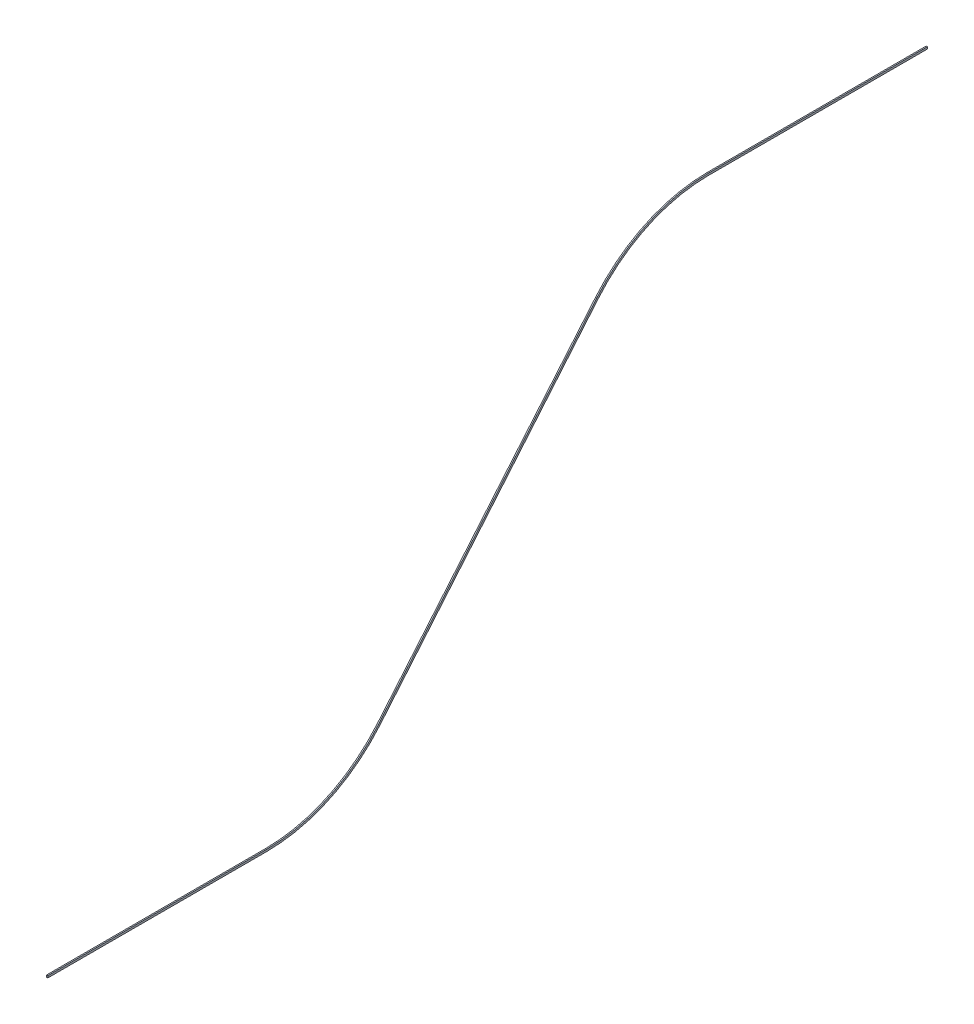
ISO-10303-21;
HEADER;
FILE_DESCRIPTION(('STEP AP214'),'2;1');
FILE_NAME('part.step','',(''),(''),'','','');
FILE_SCHEMA(('AUTOMOTIVE_DESIGN { 1 0 10303 214 1 1 1 1 }'));
ENDSEC;
DATA;
#1=APPLICATION_CONTEXT('core data for automotive mechanical design processes');
#2=APPLICATION_PROTOCOL_DEFINITION('international standard','automotive_design',2000,#1);
#3=PRODUCT_CONTEXT('',#1,'mechanical');
#4=PRODUCT('Part','Part','',(#3));
#5=PRODUCT_RELATED_PRODUCT_CATEGORY('part','',(#4));
#6=PRODUCT_DEFINITION_FORMATION('','',#4);
#7=PRODUCT_DEFINITION_CONTEXT('part definition',#1,'design');
#8=PRODUCT_DEFINITION('design','',#6,#7);
#9=PRODUCT_DEFINITION_SHAPE('','',#8);
#10=(LENGTH_UNIT() NAMED_UNIT(*) SI_UNIT(.MILLI.,.METRE.));
#11=(NAMED_UNIT(*) PLANE_ANGLE_UNIT() SI_UNIT($,.RADIAN.));
#12=(NAMED_UNIT(*) SI_UNIT($,.STERADIAN.) SOLID_ANGLE_UNIT());
#13=UNCERTAINTY_MEASURE_WITH_UNIT(LENGTH_MEASURE(1.E-05),#10,'distance_accuracy_value','');
#14=(GEOMETRIC_REPRESENTATION_CONTEXT(3) GLOBAL_UNCERTAINTY_ASSIGNED_CONTEXT((#13)) GLOBAL_UNIT_ASSIGNED_CONTEXT((#10,
#11,#12)) REPRESENTATION_CONTEXT('',''));
#15=CARTESIAN_POINT('',(0.,0.,0.));
#16=DIRECTION('',(0.,0.,1.));
#17=DIRECTION('',(1.,0.,0.));
#18=AXIS2_PLACEMENT_3D('',#15,#16,#17);
#19=CARTESIAN_POINT('',(3.4,0.,0.));
#20=DIRECTION('',(0.,0.,-1.));
#21=DIRECTION('',(-1.,0.,0.));
#22=AXIS2_PLACEMENT_3D('',#19,#20,#21);
#23=PLANE('',#22);
#24=DIRECTION('',(0.,-1.,0.));
#25=VECTOR('',#24,1.);
#26=CARTESIAN_POINT('',(0.,0.,0.));
#27=LINE('',#26,#25);
#28=CARTESIAN_POINT('',(0.,0.,0.));
#29=VERTEX_POINT('',#28);
#30=CARTESIAN_POINT('',(0.,-5.5,0.));
#31=VERTEX_POINT('',#30);
#32=EDGE_CURVE('E159',#29,#31,#27,.T.);
#33=ORIENTED_EDGE('',*,*,#32,.T.);
#34=DIRECTION('',(-1.,0.,0.));
#35=VECTOR('',#34,1.);
#36=CARTESIAN_POINT('',(3.4,-5.5,0.));
#37=LINE('',#36,#35);
#38=CARTESIAN_POINT('',(3.4,-5.5,0.));
#39=VERTEX_POINT('',#38);
#40=EDGE_CURVE('E11',#39,#31,#37,.T.);
#41=ORIENTED_EDGE('',*,*,#40,.F.);
#42=DIRECTION('',(0.,-1.,0.));
#43=VECTOR('',#42,1.);
#44=CARTESIAN_POINT('',(3.4,0.,0.));
#45=LINE('',#44,#43);
#46=CARTESIAN_POINT('',(3.4,0.,0.));
#47=VERTEX_POINT('',#46);
#48=EDGE_CURVE('E181',#47,#39,#45,.T.);
#49=ORIENTED_EDGE('',*,*,#48,.F.);
#50=DIRECTION('',(-1.,0.,0.));
#51=VECTOR('',#50,1.);
#52=CARTESIAN_POINT('',(3.4,0.,0.));
#53=LINE('',#52,#51);
#54=EDGE_CURVE('E155',#47,#29,#53,.T.);
#55=ORIENTED_EDGE('',*,*,#54,.T.);
#56=EDGE_LOOP('',(#33,#41,#49,#55));
#57=FACE_BOUND('',#56,.T.);
#58=ADVANCED_FACE('F39',(#57),#23,.F.);
#59=CARTESIAN_POINT('',(3.4,-5.5,0.));
#60=DIRECTION('',(0.,1.,0.));
#61=DIRECTION('',(0.,0.,1.));
#62=AXIS2_PLACEMENT_3D('',#59,#60,#61);
#63=PLANE('',#62);
#64=DIRECTION('',(0.,0.,-1.));
#65=VECTOR('',#64,1.);
#66=CARTESIAN_POINT('',(0.,-5.5,0.));
#67=LINE('',#66,#65);
#68=CARTESIAN_POINT('',(0.,-5.50000000000006,-600.));
#69=VERTEX_POINT('',#68);
#70=EDGE_CURVE('E162',#31,#69,#67,.T.);
#71=ORIENTED_EDGE('',*,*,#70,.T.);
#72=DIRECTION('',(-1.,0.,0.));
#73=VECTOR('',#72,1.);
#74=CARTESIAN_POINT('',(3.4,-5.50000000000006,-600.));
#75=LINE('',#74,#73);
#76=CARTESIAN_POINT('',(3.4,-5.50000000000006,-600.));
#77=VERTEX_POINT('',#76);
#78=EDGE_CURVE('E47',#77,#69,#75,.T.);
#79=ORIENTED_EDGE('',*,*,#78,.F.);
#80=DIRECTION('',(0.,0.,-1.));
#81=VECTOR('',#80,1.);
#82=CARTESIAN_POINT('',(3.4,-5.5,0.));
#83=LINE('',#82,#81);
#84=EDGE_CURVE('E110',#39,#77,#83,.T.);
#85=ORIENTED_EDGE('',*,*,#84,.F.);
#86=ORIENTED_EDGE('',*,*,#40,.T.);
#87=EDGE_LOOP('',(#71,#79,#85,#86));
#88=FACE_BOUND('',#87,.T.);
#89=ADVANCED_FACE('F259',(#88),#63,.F.);
#90=CARTESIAN_POINT('',(3.4,400.,-600.));
#91=DIRECTION('',(-1.,0.,0.));
#92=DIRECTION('',(0.,0.,1.));
#93=AXIS2_PLACEMENT_3D('',#90,#91,#92);
#94=CYLINDRICAL_SURFACE('',#93,405.5);
#95=CARTESIAN_POINT('',(0.,400.,-600.));
#96=DIRECTION('',(1.,0.,0.));
#97=DIRECTION('',(0.,0.,-1.));
#98=AXIS2_PLACEMENT_3D('',#95,#96,#97);
#99=CIRCLE('',#98,405.5);
#100=CARTESIAN_POINT('',(0.,139.349624272109,-910.631021684746));
#101=VERTEX_POINT('',#100);
#102=EDGE_CURVE('E164',#69,#101,#99,.T.);
#103=ORIENTED_EDGE('',*,*,#102,.T.);
#104=DIRECTION('',(-1.,0.,0.));
#105=VECTOR('',#104,1.);
#106=CARTESIAN_POINT('',(3.4,139.349624272109,-910.631021684746));
#107=LINE('',#106,#105);
#108=CARTESIAN_POINT('',(3.4,139.349624272109,-910.631021684746));
#109=VERTEX_POINT('',#108);
#110=EDGE_CURVE('E200',#109,#101,#107,.T.);
#111=ORIENTED_EDGE('',*,*,#110,.F.);
#112=CARTESIAN_POINT('',(3.4,400.,-600.));
#113=DIRECTION('',(1.,0.,0.));
#114=DIRECTION('',(0.,0.,-1.));
#115=AXIS2_PLACEMENT_3D('',#112,#113,#114);
#116=CIRCLE('',#115,405.5);
#117=EDGE_CURVE('E208',#77,#109,#116,.T.);
#118=ORIENTED_EDGE('',*,*,#117,.F.);
#119=ORIENTED_EDGE('',*,*,#78,.T.);
#120=EDGE_LOOP('',(#103,#111,#118,#119));
#121=FACE_BOUND('',#120,.T.);
#122=ADVANCED_FACE('F206',(#121),#94,.T.);
#123=CARTESIAN_POINT('',(3.4,139.349624272109,-910.631021684746));
#124=DIRECTION('',(0.,0.642787609686538,0.766044443118979));
#125=DIRECTION('',(0.,-0.766044443118979,0.642787609686538));
#126=AXIS2_PLACEMENT_3D('',#123,#124,#125);
#127=PLANE('',#126);
#128=DIRECTION('',(0.,0.766044443118979,-0.642787609686538));
#129=VECTOR('',#128,1.);
#130=CARTESIAN_POINT('',(0.,139.349624272109,-910.631021684746));
#131=LINE('',#130,#129);
#132=CARTESIAN_POINT('',(0.,853.579712021339,-1509.94122489084));
#133=VERTEX_POINT('',#132);
#134=EDGE_CURVE('E166',#101,#133,#131,.T.);
#135=ORIENTED_EDGE('',*,*,#134,.T.);
#136=DIRECTION('',(-1.,0.,0.));
#137=VECTOR('',#136,1.);
#138=CARTESIAN_POINT('',(3.4,853.579712021339,-1509.94122489084));
#139=LINE('',#138,#137);
#140=CARTESIAN_POINT('',(3.4,853.579712021339,-1509.94122489084));
#141=VERTEX_POINT('',#140);
#142=EDGE_CURVE('E197',#141,#133,#139,.T.);
#143=ORIENTED_EDGE('',*,*,#142,.F.);
#144=DIRECTION('',(0.,0.766044443118979,-0.642787609686538));
#145=VECTOR('',#144,1.);
#146=CARTESIAN_POINT('',(3.4,139.349624272109,-910.631021684746));
#147=LINE('',#146,#145);
#148=EDGE_CURVE('E226',#109,#141,#147,.T.);
#149=ORIENTED_EDGE('',*,*,#148,.F.);
#150=ORIENTED_EDGE('',*,*,#110,.T.);
#151=EDGE_LOOP('',(#135,#143,#149,#150));
#152=FACE_BOUND('',#151,.T.);
#153=ADVANCED_FACE('F217',(#152),#127,.F.);
#154=CARTESIAN_POINT('',(3.4,600.,-1812.14575770128));
#155=DIRECTION('',(-1.,0.,0.));
#156=DIRECTION('',(0.,0.,1.));
#157=AXIS2_PLACEMENT_3D('',#154,#155,#156);
#158=CYLINDRICAL_SURFACE('',#157,394.5);
#159=CARTESIAN_POINT('',(0.,600.,-1812.14575770128));
#160=DIRECTION('',(-1.,0.,0.));
#161=DIRECTION('',(0.,0.,1.));
#162=AXIS2_PLACEMENT_3D('',#159,#160,#161);
#163=CIRCLE('',#162,394.5);
#164=CARTESIAN_POINT('',(0.,994.5,-1812.14575770128));
#165=VERTEX_POINT('',#164);
#166=EDGE_CURVE('E168',#133,#165,#163,.T.);
#167=ORIENTED_EDGE('',*,*,#166,.T.);
#168=DIRECTION('',(-1.,0.,0.));
#169=VECTOR('',#168,1.);
#170=CARTESIAN_POINT('',(3.4,994.5,-1812.14575770128));
#171=LINE('',#170,#169);
#172=CARTESIAN_POINT('',(3.4,994.5,-1812.14575770128));
#173=VERTEX_POINT('',#172);
#174=EDGE_CURVE('E194',#173,#165,#171,.T.);
#175=ORIENTED_EDGE('',*,*,#174,.F.);
#176=CARTESIAN_POINT('',(3.4,600.,-1812.14575770128));
#177=DIRECTION('',(-1.,0.,0.));
#178=DIRECTION('',(0.,0.,1.));
#179=AXIS2_PLACEMENT_3D('',#176,#177,#178);
#180=CIRCLE('',#179,394.5);
#181=EDGE_CURVE('E223',#141,#173,#180,.T.);
#182=ORIENTED_EDGE('',*,*,#181,.F.);
#183=ORIENTED_EDGE('',*,*,#142,.T.);
#184=EDGE_LOOP('',(#167,#175,#182,#183));
#185=FACE_BOUND('',#184,.T.);
#186=ADVANCED_FACE('F221',(#185),#158,.F.);
#187=CARTESIAN_POINT('',(3.4,994.5,-1812.14575770128));
#188=DIRECTION('',(0.,1.,0.));
#189=DIRECTION('',(0.,0.,1.));
#190=AXIS2_PLACEMENT_3D('',#187,#188,#189);
#191=PLANE('',#190);
#192=DIRECTION('',(0.,0.,-1.));
#193=VECTOR('',#192,1.);
#194=CARTESIAN_POINT('',(0.,994.5,-1812.14575770128));
#195=LINE('',#194,#193);
#196=CARTESIAN_POINT('',(0.,994.5,-2412.14575770128));
#197=VERTEX_POINT('',#196);
#198=EDGE_CURVE('E170',#165,#197,#195,.T.);
#199=ORIENTED_EDGE('',*,*,#198,.T.);
#200=DIRECTION('',(-1.,0.,0.));
#201=VECTOR('',#200,1.);
#202=CARTESIAN_POINT('',(3.4,994.5,-2412.14575770128));
#203=LINE('',#202,#201);
#204=CARTESIAN_POINT('',(3.4,994.5,-2412.14575770128));
#205=VERTEX_POINT('',#204);
#206=EDGE_CURVE('E191',#205,#197,#203,.T.);
#207=ORIENTED_EDGE('',*,*,#206,.F.);
#208=DIRECTION('',(0.,0.,-1.));
#209=VECTOR('',#208,1.);
#210=CARTESIAN_POINT('',(3.4,994.5,-1812.14575770128));
#211=LINE('',#210,#209);
#212=EDGE_CURVE('E225',#173,#205,#211,.T.);
#213=ORIENTED_EDGE('',*,*,#212,.F.);
#214=ORIENTED_EDGE('',*,*,#174,.T.);
#215=EDGE_LOOP('',(#199,#207,#213,#214));
#216=FACE_BOUND('',#215,.T.);
#217=ADVANCED_FACE('F272',(#216),#191,.F.);
#218=CARTESIAN_POINT('',(3.4,994.5,-2412.14575770128));
#219=DIRECTION('',(0.,0.,1.));
#220=DIRECTION('',(1.,0.,0.));
#221=AXIS2_PLACEMENT_3D('',#218,#219,#220);
#222=PLANE('',#221);
#223=DIRECTION('',(0.,1.,0.));
#224=VECTOR('',#223,1.);
#225=CARTESIAN_POINT('',(0.,994.5,-2412.14575770128));
#226=LINE('',#225,#224);
#227=CARTESIAN_POINT('',(0.,1000.,-2412.14575770128));
#228=VERTEX_POINT('',#227);
#229=EDGE_CURVE('E172',#197,#228,#226,.T.);
#230=ORIENTED_EDGE('',*,*,#229,.T.);
#231=DIRECTION('',(-1.,0.,0.));
#232=VECTOR('',#231,1.);
#233=CARTESIAN_POINT('',(3.4,1000.,-2412.14575770128));
#234=LINE('',#233,#232);
#235=CARTESIAN_POINT('',(3.4,1000.,-2412.14575770128));
#236=VERTEX_POINT('',#235);
#237=EDGE_CURVE('E188',#236,#228,#234,.T.);
#238=ORIENTED_EDGE('',*,*,#237,.F.);
#239=DIRECTION('',(0.,1.,0.));
#240=VECTOR('',#239,1.);
#241=CARTESIAN_POINT('',(3.4,994.5,-2412.14575770128));
#242=LINE('',#241,#240);
#243=EDGE_CURVE('E228',#205,#236,#242,.T.);
#244=ORIENTED_EDGE('',*,*,#243,.F.);
#245=ORIENTED_EDGE('',*,*,#206,.T.);
#246=EDGE_LOOP('',(#230,#238,#244,#245));
#247=FACE_BOUND('',#246,.T.);
#248=ADVANCED_FACE('F275',(#247),#222,.F.);
#249=CARTESIAN_POINT('',(3.4,1000.,-1812.14575770128));
#250=DIRECTION('',(0.,-1.,0.));
#251=DIRECTION('',(0.,0.,-1.));
#252=AXIS2_PLACEMENT_3D('',#249,#250,#251);
#253=PLANE('',#252);
#254=DIRECTION('',(0.,0.,1.));
#255=VECTOR('',#254,1.);
#256=CARTESIAN_POINT('',(0.,1000.,-1812.14575770128));
#257=LINE('',#256,#255);
#258=CARTESIAN_POINT('',(0.,1000.,-1812.14575770128));
#259=VERTEX_POINT('',#258);
#260=EDGE_CURVE('E174',#228,#259,#257,.T.);
#261=ORIENTED_EDGE('',*,*,#260,.T.);
#262=DIRECTION('',(-1.,0.,0.));
#263=VECTOR('',#262,1.);
#264=CARTESIAN_POINT('',(3.4,1000.,-1812.14575770128));
#265=LINE('',#264,#263);
#266=CARTESIAN_POINT('',(3.4,1000.,-1812.14575770128));
#267=VERTEX_POINT('',#266);
#268=EDGE_CURVE('E185',#267,#259,#265,.T.);
#269=ORIENTED_EDGE('',*,*,#268,.F.);
#270=DIRECTION('',(0.,0.,1.));
#271=VECTOR('',#270,1.);
#272=CARTESIAN_POINT('',(3.4,1000.,-1812.14575770128));
#273=LINE('',#272,#271);
#274=EDGE_CURVE('E234',#236,#267,#273,.T.);
#275=ORIENTED_EDGE('',*,*,#274,.F.);
#276=ORIENTED_EDGE('',*,*,#237,.T.);
#277=EDGE_LOOP('',(#261,#269,#275,#276));
#278=FACE_BOUND('',#277,.T.);
#279=ADVANCED_FACE('F240',(#278),#253,.F.);
#280=CARTESIAN_POINT('',(3.4,600.,-1812.14575770128));
#281=DIRECTION('',(-1.,0.,0.));
#282=DIRECTION('',(0.,0.,1.));
#283=AXIS2_PLACEMENT_3D('',#280,#281,#282);
#284=CYLINDRICAL_SURFACE('',#283,400.);
#285=CARTESIAN_POINT('',(0.,600.,-1812.14575770128));
#286=DIRECTION('',(1.,0.,0.));
#287=DIRECTION('',(0.,0.,1.));
#288=AXIS2_PLACEMENT_3D('',#285,#286,#287);
#289=CIRCLE('',#288,400.);
#290=CARTESIAN_POINT('',(0.,857.115043874615,-1505.72798045369));
#291=VERTEX_POINT('',#290);
#292=EDGE_CURVE('E176',#259,#291,#289,.T.);
#293=ORIENTED_EDGE('',*,*,#292,.T.);
#294=DIRECTION('',(-1.,0.,0.));
#295=VECTOR('',#294,1.);
#296=CARTESIAN_POINT('',(3.4,857.115043874615,-1505.72798045369));
#297=LINE('',#296,#295);
#298=CARTESIAN_POINT('',(3.4,857.115043874615,-1505.72798045369));
#299=VERTEX_POINT('',#298);
#300=EDGE_CURVE('E150',#299,#291,#297,.T.);
#301=ORIENTED_EDGE('',*,*,#300,.F.);
#302=CARTESIAN_POINT('',(3.4,600.,-1812.14575770128));
#303=DIRECTION('',(1.,0.,0.));
#304=DIRECTION('',(0.,0.,1.));
#305=AXIS2_PLACEMENT_3D('',#302,#303,#304);
#306=CIRCLE('',#305,400.);
#307=EDGE_CURVE('E141',#267,#299,#306,.T.);
#308=ORIENTED_EDGE('',*,*,#307,.F.);
#309=ORIENTED_EDGE('',*,*,#268,.T.);
#310=EDGE_LOOP('',(#293,#301,#308,#309));
#311=FACE_BOUND('',#310,.T.);
#312=ADVANCED_FACE('F244',(#311),#284,.T.);
#313=CARTESIAN_POINT('',(3.4,142.884956125385,-906.417777247592));
#314=DIRECTION('',(0.,-0.642787609686538,-0.766044443118979));
#315=DIRECTION('',(0.,0.766044443118979,-0.642787609686538));
#316=AXIS2_PLACEMENT_3D('',#313,#314,#315);
#317=PLANE('',#316);
#318=DIRECTION('',(0.,-0.766044443118979,0.642787609686538));
#319=VECTOR('',#318,1.);
#320=CARTESIAN_POINT('',(0.,142.884956125385,-906.417777247592));
#321=LINE('',#320,#319);
#322=CARTESIAN_POINT('',(0.,142.884956125385,-906.417777247592));
#323=VERTEX_POINT('',#322);
#324=EDGE_CURVE('E149',#291,#323,#321,.T.);
#325=ORIENTED_EDGE('',*,*,#324,.T.);
#326=DIRECTION('',(-1.,0.,0.));
#327=VECTOR('',#326,1.);
#328=CARTESIAN_POINT('',(3.4,142.884956125385,-906.417777247592));
#329=LINE('',#328,#327);
#330=CARTESIAN_POINT('',(3.4,142.884956125385,-906.417777247592));
#331=VERTEX_POINT('',#330);
#332=EDGE_CURVE('E146',#331,#323,#329,.T.);
#333=ORIENTED_EDGE('',*,*,#332,.F.);
#334=DIRECTION('',(0.,-0.766044443118979,0.642787609686538));
#335=VECTOR('',#334,1.);
#336=CARTESIAN_POINT('',(3.4,142.884956125385,-906.417777247592));
#337=LINE('',#336,#335);
#338=EDGE_CURVE('E135',#299,#331,#337,.T.);
#339=ORIENTED_EDGE('',*,*,#338,.F.);
#340=ORIENTED_EDGE('',*,*,#300,.T.);
#341=EDGE_LOOP('',(#325,#333,#339,#340));
#342=FACE_BOUND('',#341,.T.);
#343=ADVANCED_FACE('F147',(#342),#317,.F.);
#344=CARTESIAN_POINT('',(3.4,400.,-600.));
#345=DIRECTION('',(-1.,0.,0.));
#346=DIRECTION('',(0.,0.,1.));
#347=AXIS2_PLACEMENT_3D('',#344,#345,#346);
#348=CYLINDRICAL_SURFACE('',#347,400.);
#349=CARTESIAN_POINT('',(0.,400.,-600.));
#350=DIRECTION('',(-1.,0.,0.));
#351=DIRECTION('',(0.,0.,-1.));
#352=AXIS2_PLACEMENT_3D('',#349,#350,#351);
#353=CIRCLE('',#352,400.);
#354=CARTESIAN_POINT('',(0.,0.,-600.));
#355=VERTEX_POINT('',#354);
#356=EDGE_CURVE('E96',#323,#355,#353,.T.);
#357=ORIENTED_EDGE('',*,*,#356,.T.);
#358=DIRECTION('',(-1.,0.,0.));
#359=VECTOR('',#358,1.);
#360=CARTESIAN_POINT('',(3.4,0.,-600.));
#361=LINE('',#360,#359);
#362=CARTESIAN_POINT('',(3.4,0.,-600.));
#363=VERTEX_POINT('',#362);
#364=EDGE_CURVE('E151',#363,#355,#361,.T.);
#365=ORIENTED_EDGE('',*,*,#364,.F.);
#366=CARTESIAN_POINT('',(3.4,400.,-600.));
#367=DIRECTION('',(-1.,0.,0.));
#368=DIRECTION('',(0.,0.,-1.));
#369=AXIS2_PLACEMENT_3D('',#366,#367,#368);
#370=CIRCLE('',#369,400.);
#371=EDGE_CURVE('E139',#331,#363,#370,.T.);
#372=ORIENTED_EDGE('',*,*,#371,.F.);
#373=ORIENTED_EDGE('',*,*,#332,.T.);
#374=EDGE_LOOP('',(#357,#365,#372,#373));
#375=FACE_BOUND('',#374,.T.);
#376=ADVANCED_FACE('F153',(#375),#348,.F.);
#377=CARTESIAN_POINT('',(3.4,0.,0.));
#378=DIRECTION('',(0.,-1.,0.));
#379=DIRECTION('',(0.,0.,-1.));
#380=AXIS2_PLACEMENT_3D('',#377,#378,#379);
#381=PLANE('',#380);
#382=DIRECTION('',(0.,0.,1.));
#383=VECTOR('',#382,1.);
#384=CARTESIAN_POINT('',(0.,0.,0.));
#385=LINE('',#384,#383);
#386=EDGE_CURVE('E102',#355,#29,#385,.T.);
#387=ORIENTED_EDGE('',*,*,#386,.T.);
#388=ORIENTED_EDGE('',*,*,#54,.F.);
#389=DIRECTION('',(0.,0.,1.));
#390=VECTOR('',#389,1.);
#391=CARTESIAN_POINT('',(3.4,0.,0.));
#392=LINE('',#391,#390);
#393=EDGE_CURVE('E55',#363,#47,#392,.T.);
#394=ORIENTED_EDGE('',*,*,#393,.F.);
#395=ORIENTED_EDGE('',*,*,#364,.T.);
#396=EDGE_LOOP('',(#387,#388,#394,#395));
#397=FACE_BOUND('',#396,.T.);
#398=ADVANCED_FACE('F248',(#397),#381,.F.);
#399=CARTESIAN_POINT('',(3.4,400.,-600.));
#400=DIRECTION('',(1.,0.,0.));
#401=DIRECTION('',(0.,0.,-1.));
#402=AXIS2_PLACEMENT_3D('',#399,#400,#401);
#403=PLANE('',#402);
#404=ORIENTED_EDGE('',*,*,#48,.T.);
#405=ORIENTED_EDGE('',*,*,#84,.T.);
#406=ORIENTED_EDGE('',*,*,#117,.T.);
#407=ORIENTED_EDGE('',*,*,#148,.T.);
#408=ORIENTED_EDGE('',*,*,#181,.T.);
#409=ORIENTED_EDGE('',*,*,#212,.T.);
#410=ORIENTED_EDGE('',*,*,#243,.T.);
#411=ORIENTED_EDGE('',*,*,#274,.T.);
#412=ORIENTED_EDGE('',*,*,#307,.T.);
#413=ORIENTED_EDGE('',*,*,#338,.T.);
#414=ORIENTED_EDGE('',*,*,#371,.T.);
#415=ORIENTED_EDGE('',*,*,#393,.T.);
#416=EDGE_LOOP('',(#404,#405,#406,#407,#408,#409,#410,#411,#412,#413,#414,#415));
#417=FACE_BOUND('',#416,.T.);
#418=ADVANCED_FACE('F137',(#417),#403,.T.);
#419=CARTESIAN_POINT('',(0.,400.,-600.));
#420=DIRECTION('',(1.,0.,0.));
#421=DIRECTION('',(0.,0.,-1.));
#422=AXIS2_PLACEMENT_3D('',#419,#420,#421);
#423=PLANE('',#422);
#424=ORIENTED_EDGE('',*,*,#32,.F.);
#425=ORIENTED_EDGE('',*,*,#386,.F.);
#426=ORIENTED_EDGE('',*,*,#356,.F.);
#427=ORIENTED_EDGE('',*,*,#324,.F.);
#428=ORIENTED_EDGE('',*,*,#292,.F.);
#429=ORIENTED_EDGE('',*,*,#260,.F.);
#430=ORIENTED_EDGE('',*,*,#229,.F.);
#431=ORIENTED_EDGE('',*,*,#198,.F.);
#432=ORIENTED_EDGE('',*,*,#166,.F.);
#433=ORIENTED_EDGE('',*,*,#134,.F.);
#434=ORIENTED_EDGE('',*,*,#102,.F.);
#435=ORIENTED_EDGE('',*,*,#70,.F.);
#436=EDGE_LOOP('',(#424,#425,#426,#427,#428,#429,#430,#431,#432,#433,#434,#435));
#437=FACE_BOUND('',#436,.T.);
#438=ADVANCED_FACE('F212',(#437),#423,.F.);
#439=CLOSED_SHELL('',(#58,#89,#122,#153,#186,#217,#248,#279,#312,#343,#376,#398,#418,#438));
#440=MANIFOLD_SOLID_BREP('B2',#439);
#441=ADVANCED_BREP_SHAPE_REPRESENTATION('',(#18,#440),#14);
#442=SHAPE_DEFINITION_REPRESENTATION(#9,#441);
ENDSEC;
END-ISO-10303-21;
